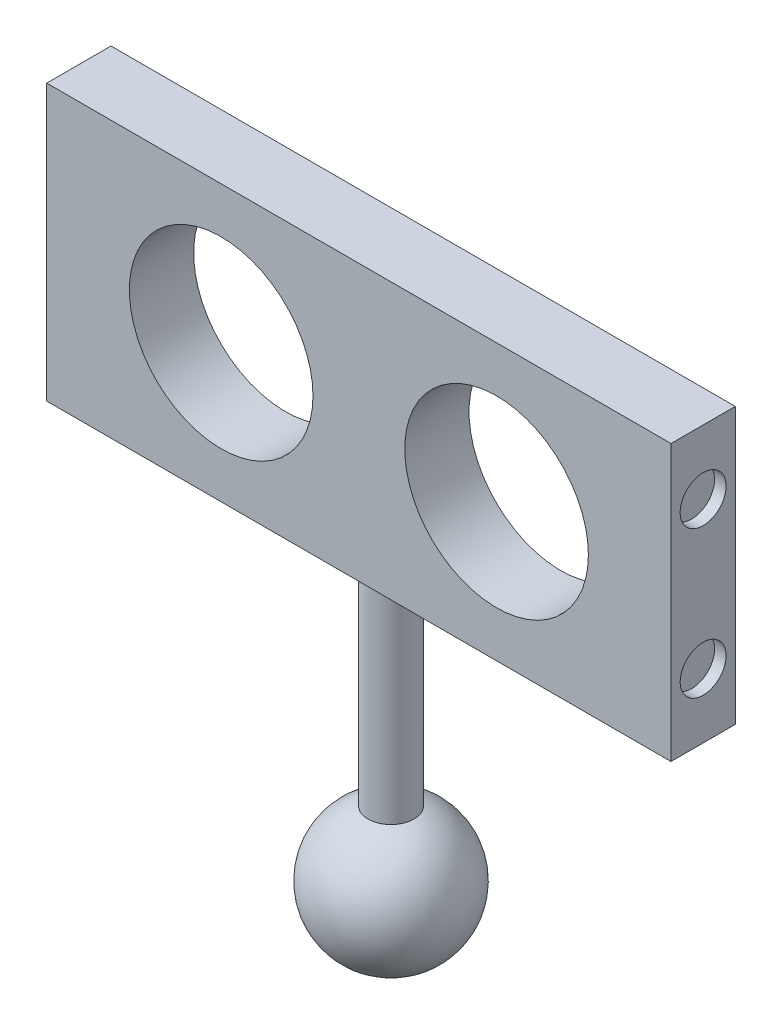
ISO-10303-21;
HEADER;
FILE_DESCRIPTION(('STEP AP214'),'2;1');
FILE_NAME('part.step','',(''),(''),'','','');
FILE_SCHEMA(('AUTOMOTIVE_DESIGN { 1 0 10303 214 1 1 1 1 }'));
ENDSEC;
DATA;
#1=APPLICATION_CONTEXT('core data for automotive mechanical design processes');
#2=APPLICATION_PROTOCOL_DEFINITION('international standard','automotive_design',2000,#1);
#3=PRODUCT_CONTEXT('',#1,'mechanical');
#4=PRODUCT('Part','Part','',(#3));
#5=PRODUCT_RELATED_PRODUCT_CATEGORY('part','',(#4));
#6=PRODUCT_DEFINITION_FORMATION('','',#4);
#7=PRODUCT_DEFINITION_CONTEXT('part definition',#1,'design');
#8=PRODUCT_DEFINITION('design','',#6,#7);
#9=PRODUCT_DEFINITION_SHAPE('','',#8);
#10=(LENGTH_UNIT() NAMED_UNIT(*) SI_UNIT(.MILLI.,.METRE.));
#11=(NAMED_UNIT(*) PLANE_ANGLE_UNIT() SI_UNIT($,.RADIAN.));
#12=(NAMED_UNIT(*) SI_UNIT($,.STERADIAN.) SOLID_ANGLE_UNIT());
#13=UNCERTAINTY_MEASURE_WITH_UNIT(LENGTH_MEASURE(1.E-05),#10,'distance_accuracy_value','');
#14=(GEOMETRIC_REPRESENTATION_CONTEXT(3) GLOBAL_UNCERTAINTY_ASSIGNED_CONTEXT((#13)) GLOBAL_UNIT_ASSIGNED_CONTEXT((#10,
#11,#12)) REPRESENTATION_CONTEXT('',''));
#15=CARTESIAN_POINT('',(0.,0.,0.));
#16=DIRECTION('',(0.,0.,1.));
#17=DIRECTION('',(1.,0.,0.));
#18=AXIS2_PLACEMENT_3D('',#15,#16,#17);
#19=CARTESIAN_POINT('',(-43.18,38.1,-4.445));
#20=DIRECTION('',(0.,0.,1.));
#21=DIRECTION('',(1.,0.,0.));
#22=AXIS2_PLACEMENT_3D('',#19,#20,#21);
#23=PLANE('',#22);
#24=DIRECTION('',(-1.,0.,0.));
#25=VECTOR('',#24,1.);
#26=CARTESIAN_POINT('',(-43.18,0.,-4.445));
#27=LINE('',#26,#25);
#28=CARTESIAN_POINT('',(43.18,0.,-4.445));
#29=VERTEX_POINT('',#28);
#30=CARTESIAN_POINT('',(-43.18,0.,-4.445));
#31=VERTEX_POINT('',#30);
#32=EDGE_CURVE('E111',#29,#31,#27,.T.);
#33=ORIENTED_EDGE('',*,*,#32,.T.);
#34=DIRECTION('',(0.,-1.,0.));
#35=VECTOR('',#34,1.);
#36=CARTESIAN_POINT('',(-43.18,38.1,-4.445));
#37=LINE('',#36,#35);
#38=CARTESIAN_POINT('',(-43.18,38.1,-4.445));
#39=VERTEX_POINT('',#38);
#40=EDGE_CURVE('E109',#39,#31,#37,.T.);
#41=ORIENTED_EDGE('',*,*,#40,.F.);
#42=DIRECTION('',(-1.,0.,0.));
#43=VECTOR('',#42,1.);
#44=CARTESIAN_POINT('',(-43.18,38.1,-4.445));
#45=LINE('',#44,#43);
#46=CARTESIAN_POINT('',(43.18,38.1,-4.445));
#47=VERTEX_POINT('',#46);
#48=EDGE_CURVE('E100',#47,#39,#45,.T.);
#49=ORIENTED_EDGE('',*,*,#48,.F.);
#50=DIRECTION('',(0.,-1.,0.));
#51=VECTOR('',#50,1.);
#52=CARTESIAN_POINT('',(43.18,38.1,-4.445));
#53=LINE('',#52,#51);
#54=EDGE_CURVE('E61',#47,#29,#53,.T.);
#55=ORIENTED_EDGE('',*,*,#54,.T.);
#56=EDGE_LOOP('',(#33,#41,#49,#55));
#57=FACE_BOUND('',#56,.T.);
#58=CARTESIAN_POINT('',(-19.05,19.05,-4.445));
#59=DIRECTION('',(0.,0.,1.));
#60=DIRECTION('',(1.,0.,0.));
#61=AXIS2_PLACEMENT_3D('',#58,#59,#60);
#62=CIRCLE('',#61,12.7);
#63=CARTESIAN_POINT('',(-6.35000000000002,19.05,-4.445));
#64=VERTEX_POINT('',#63);
#65=EDGE_CURVE('E209',#64,#64,#62,.F.);
#66=ORIENTED_EDGE('',*,*,#65,.F.);
#67=EDGE_LOOP('',(#66));
#68=FACE_BOUND('',#67,.T.);
#69=CARTESIAN_POINT('',(19.05,19.05,-4.445));
#70=DIRECTION('',(0.,0.,1.));
#71=DIRECTION('',(1.,0.,0.));
#72=AXIS2_PLACEMENT_3D('',#69,#70,#71);
#73=CIRCLE('',#72,12.7);
#74=CARTESIAN_POINT('',(31.75,19.05,-4.445));
#75=VERTEX_POINT('',#74);
#76=EDGE_CURVE('E127',#75,#75,#73,.T.);
#77=ORIENTED_EDGE('',*,*,#76,.T.);
#78=EDGE_LOOP('',(#77));
#79=FACE_BOUND('',#78,.T.);
#80=ADVANCED_FACE('F50',(#57,#68,#79),#23,.F.);
#81=CARTESIAN_POINT('',(-43.18,38.1,4.445));
#82=DIRECTION('',(0.,0.,-1.));
#83=DIRECTION('',(-1.,0.,0.));
#84=AXIS2_PLACEMENT_3D('',#81,#82,#83);
#85=PLANE('',#84);
#86=DIRECTION('',(1.,0.,0.));
#87=VECTOR('',#86,1.);
#88=CARTESIAN_POINT('',(-43.18,0.,4.445));
#89=LINE('',#88,#87);
#90=CARTESIAN_POINT('',(-43.18,0.,4.445));
#91=VERTEX_POINT('',#90);
#92=CARTESIAN_POINT('',(43.18,0.,4.445));
#93=VERTEX_POINT('',#92);
#94=EDGE_CURVE('E92',#91,#93,#89,.T.);
#95=ORIENTED_EDGE('',*,*,#94,.T.);
#96=DIRECTION('',(0.,-1.,0.));
#97=VECTOR('',#96,1.);
#98=CARTESIAN_POINT('',(43.18,38.1,4.445));
#99=LINE('',#98,#97);
#100=CARTESIAN_POINT('',(43.18,38.1,4.445));
#101=VERTEX_POINT('',#100);
#102=EDGE_CURVE('E119',#101,#93,#99,.T.);
#103=ORIENTED_EDGE('',*,*,#102,.F.);
#104=DIRECTION('',(1.,0.,0.));
#105=VECTOR('',#104,1.);
#106=CARTESIAN_POINT('',(-43.18,38.1,4.445));
#107=LINE('',#106,#105);
#108=CARTESIAN_POINT('',(-43.18,38.1,4.445));
#109=VERTEX_POINT('',#108);
#110=EDGE_CURVE('E69',#109,#101,#107,.T.);
#111=ORIENTED_EDGE('',*,*,#110,.F.);
#112=DIRECTION('',(0.,-1.,0.));
#113=VECTOR('',#112,1.);
#114=CARTESIAN_POINT('',(-43.18,38.1,4.445));
#115=LINE('',#114,#113);
#116=EDGE_CURVE('E113',#109,#91,#115,.T.);
#117=ORIENTED_EDGE('',*,*,#116,.T.);
#118=EDGE_LOOP('',(#95,#103,#111,#117));
#119=FACE_BOUND('',#118,.T.);
#120=CARTESIAN_POINT('',(-19.05,19.05,4.445));
#121=DIRECTION('',(0.,0.,1.));
#122=DIRECTION('',(1.,0.,0.));
#123=AXIS2_PLACEMENT_3D('',#120,#121,#122);
#124=CIRCLE('',#123,12.7);
#125=CARTESIAN_POINT('',(-6.35000000000002,19.05,4.445));
#126=VERTEX_POINT('',#125);
#127=EDGE_CURVE('E213',#126,#126,#124,.F.);
#128=ORIENTED_EDGE('',*,*,#127,.T.);
#129=EDGE_LOOP('',(#128));
#130=FACE_BOUND('',#129,.T.);
#131=CARTESIAN_POINT('',(19.05,19.05,4.445));
#132=DIRECTION('',(0.,0.,1.));
#133=DIRECTION('',(1.,0.,0.));
#134=AXIS2_PLACEMENT_3D('',#131,#132,#133);
#135=CIRCLE('',#134,12.7);
#136=CARTESIAN_POINT('',(31.75,19.05,4.445));
#137=VERTEX_POINT('',#136);
#138=EDGE_CURVE('E205',#137,#137,#135,.T.);
#139=ORIENTED_EDGE('',*,*,#138,.F.);
#140=EDGE_LOOP('',(#139));
#141=FACE_BOUND('',#140,.T.);
#142=ADVANCED_FACE('F158',(#119,#130,#141),#85,.F.);
#143=CARTESIAN_POINT('',(43.18,38.1,-4.445));
#144=DIRECTION('',(-1.,0.,0.));
#145=DIRECTION('',(0.,0.,1.));
#146=AXIS2_PLACEMENT_3D('',#143,#144,#145);
#147=PLANE('',#146);
#148=CARTESIAN_POINT('',(43.18,29.21,0.));
#149=DIRECTION('',(1.,0.,0.));
#150=DIRECTION('',(0.,0.,-1.));
#151=AXIS2_PLACEMENT_3D('',#148,#149,#150);
#152=CIRCLE('',#151,3.175);
#153=CARTESIAN_POINT('',(43.18,29.21,-3.175));
#154=VERTEX_POINT('',#153);
#155=EDGE_CURVE('E189',#154,#154,#152,.T.);
#156=ORIENTED_EDGE('',*,*,#155,.F.);
#157=EDGE_LOOP('',(#156));
#158=FACE_BOUND('',#157,.T.);
#159=CARTESIAN_POINT('',(43.18,8.89000000000002,0.));
#160=DIRECTION('',(1.,0.,0.));
#161=DIRECTION('',(0.,0.,1.));
#162=AXIS2_PLACEMENT_3D('',#159,#160,#161);
#163=CIRCLE('',#162,3.175);
#164=CARTESIAN_POINT('',(43.18,8.89000000000002,3.175));
#165=VERTEX_POINT('',#164);
#166=EDGE_CURVE('E197',#165,#165,#163,.T.);
#167=ORIENTED_EDGE('',*,*,#166,.F.);
#168=EDGE_LOOP('',(#167));
#169=FACE_BOUND('',#168,.T.);
#170=DIRECTION('',(0.,0.,-1.));
#171=VECTOR('',#170,1.);
#172=CARTESIAN_POINT('',(43.18,0.,-4.445));
#173=LINE('',#172,#171);
#174=EDGE_CURVE('E123',#93,#29,#173,.T.);
#175=ORIENTED_EDGE('',*,*,#174,.T.);
#176=ORIENTED_EDGE('',*,*,#54,.F.);
#177=DIRECTION('',(0.,0.,-1.));
#178=VECTOR('',#177,1.);
#179=CARTESIAN_POINT('',(43.18,38.1,-4.445));
#180=LINE('',#179,#178);
#181=EDGE_CURVE('E105',#101,#47,#180,.T.);
#182=ORIENTED_EDGE('',*,*,#181,.F.);
#183=ORIENTED_EDGE('',*,*,#102,.T.);
#184=EDGE_LOOP('',(#175,#176,#182,#183));
#185=FACE_BOUND('',#184,.T.);
#186=ADVANCED_FACE('F52',(#158,#169,#185),#147,.F.);
#187=CARTESIAN_POINT('',(-43.18,38.1,-4.445));
#188=DIRECTION('',(1.,0.,0.));
#189=DIRECTION('',(0.,0.,-1.));
#190=AXIS2_PLACEMENT_3D('',#187,#188,#189);
#191=PLANE('',#190);
#192=CARTESIAN_POINT('',(-43.18,29.21,0.));
#193=DIRECTION('',(1.,0.,0.));
#194=DIRECTION('',(0.,0.,-1.));
#195=AXIS2_PLACEMENT_3D('',#192,#193,#194);
#196=CIRCLE('',#195,3.175);
#197=CARTESIAN_POINT('',(-43.18,29.21,-3.175));
#198=VERTEX_POINT('',#197);
#199=EDGE_CURVE('E172',#198,#198,#196,.T.);
#200=ORIENTED_EDGE('',*,*,#199,.T.);
#201=EDGE_LOOP('',(#200));
#202=FACE_BOUND('',#201,.T.);
#203=CARTESIAN_POINT('',(-43.18,8.89000000000002,0.));
#204=DIRECTION('',(1.,0.,0.));
#205=DIRECTION('',(0.,0.,1.));
#206=AXIS2_PLACEMENT_3D('',#203,#204,#205);
#207=CIRCLE('',#206,3.175);
#208=CARTESIAN_POINT('',(-43.18,8.89000000000002,3.175));
#209=VERTEX_POINT('',#208);
#210=EDGE_CURVE('E175',#209,#209,#207,.T.);
#211=ORIENTED_EDGE('',*,*,#210,.T.);
#212=EDGE_LOOP('',(#211));
#213=FACE_BOUND('',#212,.T.);
#214=DIRECTION('',(0.,0.,1.));
#215=VECTOR('',#214,1.);
#216=CARTESIAN_POINT('',(-43.18,0.,-4.445));
#217=LINE('',#216,#215);
#218=EDGE_CURVE('E86',#31,#91,#217,.T.);
#219=ORIENTED_EDGE('',*,*,#218,.T.);
#220=ORIENTED_EDGE('',*,*,#116,.F.);
#221=DIRECTION('',(0.,0.,1.));
#222=VECTOR('',#221,1.);
#223=CARTESIAN_POINT('',(-43.18,38.1,-4.445));
#224=LINE('',#223,#222);
#225=EDGE_CURVE('E103',#39,#109,#224,.T.);
#226=ORIENTED_EDGE('',*,*,#225,.F.);
#227=ORIENTED_EDGE('',*,*,#40,.T.);
#228=EDGE_LOOP('',(#219,#220,#226,#227));
#229=FACE_BOUND('',#228,.T.);
#230=ADVANCED_FACE('F115',(#202,#213,#229),#191,.F.);
#231=CARTESIAN_POINT('',(0.,38.1,0.));
#232=DIRECTION('',(0.,1.,0.));
#233=DIRECTION('',(0.,0.,1.));
#234=AXIS2_PLACEMENT_3D('',#231,#232,#233);
#235=PLANE('',#234);
#236=ORIENTED_EDGE('',*,*,#181,.T.);
#237=ORIENTED_EDGE('',*,*,#48,.T.);
#238=ORIENTED_EDGE('',*,*,#225,.T.);
#239=ORIENTED_EDGE('',*,*,#110,.T.);
#240=EDGE_LOOP('',(#236,#237,#238,#239));
#241=FACE_BOUND('',#240,.T.);
#242=ADVANCED_FACE('F101',(#241),#235,.T.);
#243=CARTESIAN_POINT('',(0.,0.,0.));
#244=DIRECTION('',(0.,1.,0.));
#245=DIRECTION('',(0.,0.,1.));
#246=AXIS2_PLACEMENT_3D('',#243,#244,#245);
#247=PLANE('',#246);
#248=CARTESIAN_POINT('',(0.,0.,0.));
#249=DIRECTION('',(0.,1.,0.));
#250=DIRECTION('',(0.,0.,1.));
#251=AXIS2_PLACEMENT_3D('',#248,#249,#250);
#252=CIRCLE('',#251,3.175);
#253=CARTESIAN_POINT('',(0.,0.,3.175));
#254=VERTEX_POINT('',#253);
#255=EDGE_CURVE('E13',#254,#254,#252,.F.);
#256=ORIENTED_EDGE('',*,*,#255,.F.);
#257=EDGE_LOOP('',(#256));
#258=FACE_BOUND('',#257,.T.);
#259=ORIENTED_EDGE('',*,*,#174,.F.);
#260=ORIENTED_EDGE('',*,*,#94,.F.);
#261=ORIENTED_EDGE('',*,*,#218,.F.);
#262=ORIENTED_EDGE('',*,*,#32,.F.);
#263=EDGE_LOOP('',(#259,#260,#261,#262));
#264=FACE_BOUND('',#263,.T.);
#265=ADVANCED_FACE('F142',(#258,#264),#247,.F.);
#266=CARTESIAN_POINT('',(-19.05,19.05,-4.445));
#267=DIRECTION('',(0.,0.,1.));
#268=DIRECTION('',(1.,0.,0.));
#269=AXIS2_PLACEMENT_3D('',#266,#267,#268);
#270=CYLINDRICAL_SURFACE('',#269,12.7);
#271=ORIENTED_EDGE('',*,*,#65,.T.);
#272=EDGE_LOOP('',(#271));
#273=FACE_BOUND('',#272,.T.);
#274=ORIENTED_EDGE('',*,*,#127,.F.);
#275=EDGE_LOOP('',(#274));
#276=FACE_BOUND('',#275,.T.);
#277=ADVANCED_FACE('F144',(#273,#276),#270,.F.);
#278=CARTESIAN_POINT('',(19.05,19.05,-4.445));
#279=DIRECTION('',(0.,0.,1.));
#280=DIRECTION('',(1.,0.,0.));
#281=AXIS2_PLACEMENT_3D('',#278,#279,#280);
#282=CYLINDRICAL_SURFACE('',#281,12.7);
#283=ORIENTED_EDGE('',*,*,#76,.F.);
#284=EDGE_LOOP('',(#283));
#285=FACE_BOUND('',#284,.T.);
#286=ORIENTED_EDGE('',*,*,#138,.T.);
#287=EDGE_LOOP('',(#286));
#288=FACE_BOUND('',#287,.T.);
#289=ADVANCED_FACE('F151',(#285,#288),#282,.F.);
#290=CARTESIAN_POINT('',(0.,-38.1,0.));
#291=DIRECTION('',(0.,1.,0.));
#292=DIRECTION('',(0.,0.,1.));
#293=AXIS2_PLACEMENT_3D('',#290,#291,#292);
#294=CYLINDRICAL_SURFACE('',#293,3.175);
#295=CARTESIAN_POINT('',(0.,-29.1197438789308,0.));
#296=DIRECTION('',(0.,-1.,0.));
#297=DIRECTION('',(0.,0.,-1.));
#298=AXIS2_PLACEMENT_3D('',#295,#296,#297);
#299=CIRCLE('',#298,3.175);
#300=CARTESIAN_POINT('',(0.,-29.1197438789308,3.175));
#301=VERTEX_POINT('',#300);
#302=EDGE_CURVE('E54',#301,#301,#299,.F.);
#303=CARTESIAN_POINT('',(0.,-29.1197438789308,3.175));
#304=CARTESIAN_POINT('',(0.,-28.8164132135253,3.175));
#305=CARTESIAN_POINT('',(0.,-28.5130825481198,3.175));
#306=CARTESIAN_POINT('',(0.,-27.9064212173087,3.175));
#307=CARTESIAN_POINT('',(0.,-27.6030905519032,3.175));
#308=CARTESIAN_POINT('',(0.,-26.9964292210921,3.175));
#309=CARTESIAN_POINT('',(0.,-26.6930985556866,3.175));
#310=CARTESIAN_POINT('',(0.,-26.0864372248755,3.175));
#311=CARTESIAN_POINT('',(0.,-25.78310655947,3.175));
#312=CARTESIAN_POINT('',(0.,-25.176445228659,3.175));
#313=CARTESIAN_POINT('',(0.,-24.8731145632534,3.175));
#314=CARTESIAN_POINT('',(0.,-24.2664532324424,3.175));
#315=CARTESIAN_POINT('',(0.,-23.9631225670368,3.175));
#316=CARTESIAN_POINT('',(0.,-23.3564612362258,3.175));
#317=CARTESIAN_POINT('',(0.,-23.0531305708203,3.175));
#318=CARTESIAN_POINT('',(0.,-22.4464692400092,3.175));
#319=CARTESIAN_POINT('',(0.,-22.1431385746037,3.175));
#320=CARTESIAN_POINT('',(0.,-21.5364772437926,3.175));
#321=CARTESIAN_POINT('',(0.,-21.2331465783871,3.175));
#322=CARTESIAN_POINT('',(0.,-20.626485247576,3.175));
#323=CARTESIAN_POINT('',(0.,-20.3231545821705,3.175));
#324=CARTESIAN_POINT('',(0.,-19.7164932513594,3.175));
#325=CARTESIAN_POINT('',(0.,-19.4131625859539,3.175));
#326=CARTESIAN_POINT('',(0.,-18.8065012551428,3.175));
#327=CARTESIAN_POINT('',(0.,-18.5031705897373,3.175));
#328=CARTESIAN_POINT('',(0.,-17.8965092589262,3.175));
#329=CARTESIAN_POINT('',(0.,-17.5931785935207,3.175));
#330=CARTESIAN_POINT('',(0.,-16.9865172627097,3.175));
#331=CARTESIAN_POINT('',(0.,-16.6831865973041,3.175));
#332=CARTESIAN_POINT('',(0.,-16.0765252664931,3.175));
#333=CARTESIAN_POINT('',(0.,-15.7731946010875,3.175));
#334=CARTESIAN_POINT('',(0.,-15.1665332702765,3.175));
#335=CARTESIAN_POINT('',(0.,-14.863202604871,3.175));
#336=CARTESIAN_POINT('',(0.,-14.2565412740599,3.175));
#337=CARTESIAN_POINT('',(0.,-13.9532106086544,3.175));
#338=CARTESIAN_POINT('',(0.,-13.3465492778433,3.175));
#339=CARTESIAN_POINT('',(0.,-13.0432186124378,3.175));
#340=CARTESIAN_POINT('',(0.,-12.4365572816267,3.175));
#341=CARTESIAN_POINT('',(0.,-12.1332266162212,3.175));
#342=CARTESIAN_POINT('',(0.,-11.5265652854101,3.175));
#343=CARTESIAN_POINT('',(0.,-11.2232346200046,3.175));
#344=CARTESIAN_POINT('',(0.,-10.6165732891935,3.175));
#345=CARTESIAN_POINT('',(0.,-10.313242623788,3.175));
#346=CARTESIAN_POINT('',(0.,-9.70658129297695,3.175));
#347=CARTESIAN_POINT('',(0.,-9.40325062757142,3.175));
#348=CARTESIAN_POINT('',(0.,-8.79658929676036,3.175));
#349=CARTESIAN_POINT('',(0.,-8.49325863135483,3.175));
#350=CARTESIAN_POINT('',(0.,-7.88659730054377,3.175));
#351=CARTESIAN_POINT('',(0.,-7.58326663513824,3.175));
#352=CARTESIAN_POINT('',(0.,-6.97660530432718,3.175));
#353=CARTESIAN_POINT('',(0.,-6.67327463892165,3.175));
#354=CARTESIAN_POINT('',(0.,-6.0666133081106,3.175));
#355=CARTESIAN_POINT('',(0.,-5.76328264270507,3.175));
#356=CARTESIAN_POINT('',(0.,-5.15662131189401,3.175));
#357=CARTESIAN_POINT('',(0.,-4.85329064648847,3.175));
#358=CARTESIAN_POINT('',(0.,-4.24662931567741,3.175));
#359=CARTESIAN_POINT('',(0.,-3.94329865027189,3.175));
#360=CARTESIAN_POINT('',(0.,-3.33663731946083,3.175));
#361=CARTESIAN_POINT('',(0.,-3.0333066540553,3.175));
#362=CARTESIAN_POINT('',(0.,-2.42664532324424,3.175));
#363=CARTESIAN_POINT('',(0.,-2.12331465783871,3.175));
#364=CARTESIAN_POINT('',(0.,-1.51665332702765,3.175));
#365=CARTESIAN_POINT('',(0.,-1.21332266162212,3.175));
#366=CARTESIAN_POINT('',(0.,-0.606661330811063,3.175));
#367=CARTESIAN_POINT('',(0.,-0.303330665405531,3.175));
#368=CARTESIAN_POINT('',(0.,0.,3.175));
#369=B_SPLINE_CURVE_WITH_KNOTS('',3,(#303,#304,#305,#306,#307,#308,#309,#310,#311,#312,#313,
#314,#315,#316,#317,#318,#319,#320,#321,#322,#323,#324,#325,#326,#327,#328,#329,#330,#331,#332,
#333,#334,#335,#336,#337,#338,#339,#340,#341,#342,#343,#344,#345,#346,#347,#348,#349,#350,#351,
#352,#353,#354,#355,#356,#357,#358,#359,#360,#361,#362,#363,#364,#365,#366,#367,#368),
.UNSPECIFIED.,.F.,.F.,(4,2,2,2,2,2,2,2,2,2,2,2,2,2,2,2,2,2,2,2,2,2,2,2,2,2,2,2,2,2,2,2,4),(0.,
0.909991996216591,1.81998399243318,2.72997598864977,3.63996798486636,4.54995998108295,
5.45995197729954,6.36994397351612,7.27993596973271,8.1899279659493,9.09991996216589,
10.0099119583825,10.9199039545991,11.8298959508157,12.7398879470322,13.6498799432488,
14.5598719394654,15.469863935682,16.3798559318986,17.2898479281152,18.1998399243318,
19.1098319205484,20.019823916765,20.9298159129815,21.8398079091981,22.7497999054147,
23.6597919016313,24.5697838978479,25.4797758940645,26.3897678902811,27.2997598864977,
28.2097518827143,29.1197438789308),.UNSPECIFIED.);
#370=EDGE_CURVE('BSEAM263',#301,#254,#369,.T.);
#371=ORIENTED_EDGE('',*,*,#302,.T.);
#372=ORIENTED_EDGE('',*,*,#255,.T.);
#373=ORIENTED_EDGE('',*,*,#370,.T.);
#374=ORIENTED_EDGE('',*,*,#370,.F.);
#375=EDGE_LOOP('',(#371,#373,#372,#374));
#376=FACE_BOUND('',#375,.T.);
#377=ADVANCED_FACE('F263',(#376),#294,.T.);
#378=CARTESIAN_POINT('',(0.,-38.1,0.));
#379=DIRECTION('',(0.,0.,-1.));
#380=DIRECTION('',(1.,0.,0.));
#381=AXIS2_PLACEMENT_3D('',#378,#379,#380);
#382=SPHERICAL_SURFACE('',#381,9.525);
#383=CARTESIAN_POINT('',(0.,-38.1,0.));
#384=DIRECTION('',(0.,-1.,0.));
#385=DIRECTION('',(0.,0.,-1.));
#386=AXIS2_PLACEMENT_3D('',#383,#384,#385);
#387=SPHERICAL_SURFACE('',#386,9.525);
#388=ORIENTED_EDGE('',*,*,#302,.F.);
#389=EDGE_LOOP('',(#388));
#390=FACE_BOUND('',#389,.T.);
#391=ADVANCED_FACE('F259',(#390),#387,.T.);
#392=CARTESIAN_POINT('',(41.5925,8.89000000000002,0.));
#393=DIRECTION('',(1.,0.,0.));
#394=DIRECTION('',(0.,0.,-1.));
#395=AXIS2_PLACEMENT_3D('',#392,#393,#394);
#396=CYLINDRICAL_SURFACE('',#395,3.175);
#397=CARTESIAN_POINT('',(41.5925,8.89000000000002,0.));
#398=DIRECTION('',(1.,0.,0.));
#399=DIRECTION('',(0.,0.,1.));
#400=AXIS2_PLACEMENT_3D('',#397,#398,#399);
#401=CIRCLE('',#400,3.175);
#402=CARTESIAN_POINT('',(41.5925,8.89000000000002,3.175));
#403=VERTEX_POINT('',#402);
#404=EDGE_CURVE('E193',#403,#403,#401,.T.);
#405=ORIENTED_EDGE('',*,*,#404,.F.);
#406=EDGE_LOOP('',(#405));
#407=FACE_BOUND('',#406,.T.);
#408=ORIENTED_EDGE('',*,*,#166,.T.);
#409=EDGE_LOOP('',(#408));
#410=FACE_BOUND('',#409,.T.);
#411=ADVANCED_FACE('F255',(#407,#410),#396,.F.);
#412=CARTESIAN_POINT('',(41.5925,8.89000000000002,0.));
#413=DIRECTION('',(-1.,0.,0.));
#414=DIRECTION('',(0.,0.,1.));
#415=AXIS2_PLACEMENT_3D('',#412,#413,#414);
#416=PLANE('',#415);
#417=ORIENTED_EDGE('',*,*,#404,.T.);
#418=EDGE_LOOP('',(#417));
#419=FACE_BOUND('',#418,.T.);
#420=ADVANCED_FACE('F251',(#419),#416,.F.);
#421=CARTESIAN_POINT('',(41.5925,29.21,0.));
#422=DIRECTION('',(1.,0.,0.));
#423=DIRECTION('',(0.,0.,-1.));
#424=AXIS2_PLACEMENT_3D('',#421,#422,#423);
#425=CYLINDRICAL_SURFACE('',#424,3.175);
#426=CARTESIAN_POINT('',(41.5925,29.21,0.));
#427=DIRECTION('',(1.,0.,0.));
#428=DIRECTION('',(0.,0.,-1.));
#429=AXIS2_PLACEMENT_3D('',#426,#427,#428);
#430=CIRCLE('',#429,3.175);
#431=CARTESIAN_POINT('',(41.5925,29.21,-3.175));
#432=VERTEX_POINT('',#431);
#433=EDGE_CURVE('E185',#432,#432,#430,.T.);
#434=ORIENTED_EDGE('',*,*,#433,.F.);
#435=EDGE_LOOP('',(#434));
#436=FACE_BOUND('',#435,.T.);
#437=ORIENTED_EDGE('',*,*,#155,.T.);
#438=EDGE_LOOP('',(#437));
#439=FACE_BOUND('',#438,.T.);
#440=ADVANCED_FACE('F247',(#436,#439),#425,.F.);
#441=CARTESIAN_POINT('',(41.5925,29.21,0.));
#442=DIRECTION('',(1.,0.,0.));
#443=DIRECTION('',(0.,0.,-1.));
#444=AXIS2_PLACEMENT_3D('',#441,#442,#443);
#445=PLANE('',#444);
#446=ORIENTED_EDGE('',*,*,#433,.T.);
#447=EDGE_LOOP('',(#446));
#448=FACE_BOUND('',#447,.T.);
#449=ADVANCED_FACE('F243',(#448),#445,.T.);
#450=CARTESIAN_POINT('',(-41.5925,8.89000000000002,0.));
#451=DIRECTION('',(-1.,0.,0.));
#452=DIRECTION('',(0.,0.,1.));
#453=AXIS2_PLACEMENT_3D('',#450,#451,#452);
#454=CYLINDRICAL_SURFACE('',#453,3.175);
#455=CARTESIAN_POINT('',(-41.5925,8.89000000000002,0.));
#456=DIRECTION('',(1.,0.,0.));
#457=DIRECTION('',(0.,0.,1.));
#458=AXIS2_PLACEMENT_3D('',#455,#456,#457);
#459=CIRCLE('',#458,3.175);
#460=CARTESIAN_POINT('',(-41.5925,8.89000000000002,3.175));
#461=VERTEX_POINT('',#460);
#462=EDGE_CURVE('E178',#461,#461,#459,.T.);
#463=ORIENTED_EDGE('',*,*,#462,.T.);
#464=EDGE_LOOP('',(#463));
#465=FACE_BOUND('',#464,.T.);
#466=ORIENTED_EDGE('',*,*,#210,.F.);
#467=EDGE_LOOP('',(#466));
#468=FACE_BOUND('',#467,.T.);
#469=ADVANCED_FACE('F239',(#465,#468),#454,.F.);
#470=CARTESIAN_POINT('',(-41.5925,8.89000000000002,0.));
#471=DIRECTION('',(1.,0.,0.));
#472=DIRECTION('',(0.,0.,1.));
#473=AXIS2_PLACEMENT_3D('',#470,#471,#472);
#474=PLANE('',#473);
#475=ORIENTED_EDGE('',*,*,#462,.F.);
#476=EDGE_LOOP('',(#475));
#477=FACE_BOUND('',#476,.T.);
#478=ADVANCED_FACE('F234',(#477),#474,.F.);
#479=CARTESIAN_POINT('',(-41.5925,29.21,0.));
#480=DIRECTION('',(-1.,0.,0.));
#481=DIRECTION('',(0.,0.,1.));
#482=AXIS2_PLACEMENT_3D('',#479,#480,#481);
#483=CYLINDRICAL_SURFACE('',#482,3.175);
#484=CARTESIAN_POINT('',(-41.5925,29.21,0.));
#485=DIRECTION('',(1.,0.,0.));
#486=DIRECTION('',(0.,0.,-1.));
#487=AXIS2_PLACEMENT_3D('',#484,#485,#486);
#488=CIRCLE('',#487,3.175);
#489=CARTESIAN_POINT('',(-41.5925,29.21,-3.175));
#490=VERTEX_POINT('',#489);
#491=EDGE_CURVE('E201',#490,#490,#488,.T.);
#492=ORIENTED_EDGE('',*,*,#491,.T.);
#493=EDGE_LOOP('',(#492));
#494=FACE_BOUND('',#493,.T.);
#495=ORIENTED_EDGE('',*,*,#199,.F.);
#496=EDGE_LOOP('',(#495));
#497=FACE_BOUND('',#496,.T.);
#498=ADVANCED_FACE('F225',(#494,#497),#483,.F.);
#499=CARTESIAN_POINT('',(-41.5925,29.21,0.));
#500=DIRECTION('',(-1.,0.,0.));
#501=DIRECTION('',(0.,0.,-1.));
#502=AXIS2_PLACEMENT_3D('',#499,#500,#501);
#503=PLANE('',#502);
#504=ORIENTED_EDGE('',*,*,#491,.F.);
#505=EDGE_LOOP('',(#504));
#506=FACE_BOUND('',#505,.T.);
#507=ADVANCED_FACE('F228',(#506),#503,.T.);
#508=CLOSED_SHELL('',(#80,#142,#186,#230,#242,#265,#277,#289,#377,#391,#411,#420,#440,#449,#469,
#478,#498,#507));
#509=MANIFOLD_SOLID_BREP('B2',#508);
#510=ADVANCED_BREP_SHAPE_REPRESENTATION('',(#18,#509),#14);
#511=SHAPE_DEFINITION_REPRESENTATION(#9,#510);
ENDSEC;
END-ISO-10303-21;
